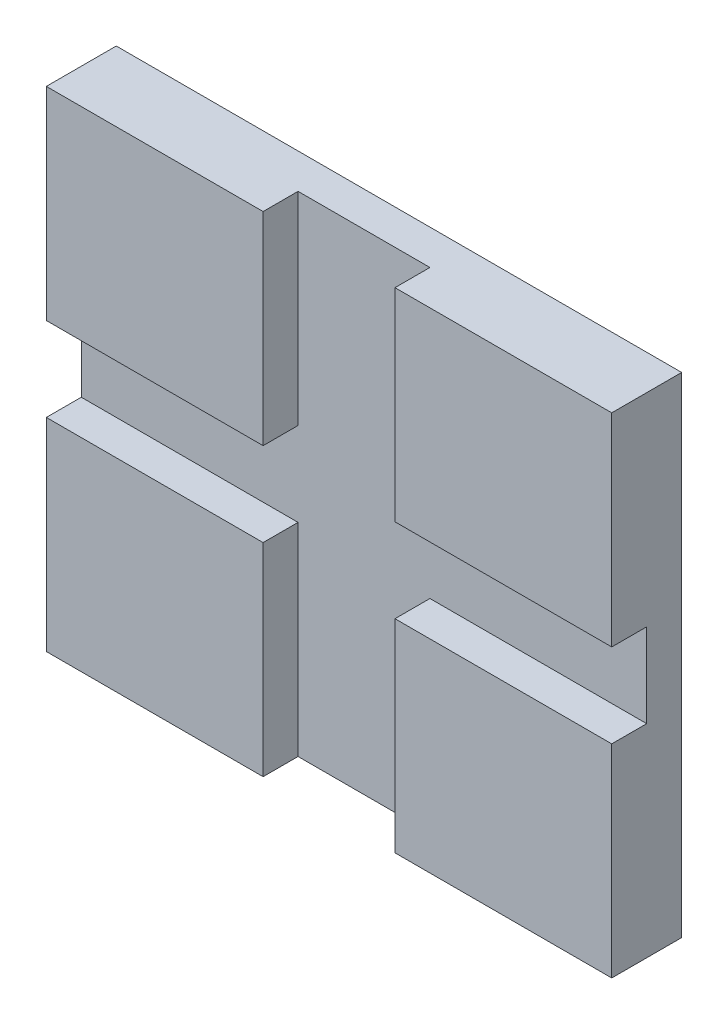
ISO-10303-21;
HEADER;
FILE_DESCRIPTION(('STEP AP214'),'2;1');
FILE_NAME('part.step','',(''),(''),'','','');
FILE_SCHEMA(('AUTOMOTIVE_DESIGN { 1 0 10303 214 1 1 1 1 }'));
ENDSEC;
DATA;
#1=APPLICATION_CONTEXT('core data for automotive mechanical design processes');
#2=APPLICATION_PROTOCOL_DEFINITION('international standard','automotive_design',2000,#1);
#3=PRODUCT_CONTEXT('',#1,'mechanical');
#4=PRODUCT('Part','Part','',(#3));
#5=PRODUCT_RELATED_PRODUCT_CATEGORY('part','',(#4));
#6=PRODUCT_DEFINITION_FORMATION('','',#4);
#7=PRODUCT_DEFINITION_CONTEXT('part definition',#1,'design');
#8=PRODUCT_DEFINITION('design','',#6,#7);
#9=PRODUCT_DEFINITION_SHAPE('','',#8);
#10=(LENGTH_UNIT() NAMED_UNIT(*) SI_UNIT(.MILLI.,.METRE.));
#11=(NAMED_UNIT(*) PLANE_ANGLE_UNIT() SI_UNIT($,.RADIAN.));
#12=(NAMED_UNIT(*) SI_UNIT($,.STERADIAN.) SOLID_ANGLE_UNIT());
#13=UNCERTAINTY_MEASURE_WITH_UNIT(LENGTH_MEASURE(1.E-05),#10,'distance_accuracy_value','');
#14=(GEOMETRIC_REPRESENTATION_CONTEXT(3) GLOBAL_UNCERTAINTY_ASSIGNED_CONTEXT((#13)) GLOBAL_UNIT_ASSIGNED_CONTEXT((#10,
#11,#12)) REPRESENTATION_CONTEXT('',''));
#15=CARTESIAN_POINT('',(0.,0.,0.));
#16=DIRECTION('',(0.,0.,1.));
#17=DIRECTION('',(1.,0.,0.));
#18=AXIS2_PLACEMENT_3D('',#15,#16,#17);
#19=CARTESIAN_POINT('',(-80.86,0.,10.));
#20=DIRECTION('',(1.,0.,0.));
#21=DIRECTION('',(0.,1.,0.));
#22=AXIS2_PLACEMENT_3D('',#19,#20,#21);
#23=PLANE('',#22);
#24=DIRECTION('',(0.,-1.,0.));
#25=VECTOR('',#24,1.);
#26=CARTESIAN_POINT('',(-80.86,0.,0.));
#27=LINE('',#26,#25);
#28=CARTESIAN_POINT('',(-80.86,70.,0.));
#29=VERTEX_POINT('',#28);
#30=CARTESIAN_POINT('',(-80.86,-70.,0.));
#31=VERTEX_POINT('',#30);
#32=EDGE_CURVE('E318',#29,#31,#27,.T.);
#33=ORIENTED_EDGE('',*,*,#32,.T.);
#34=DIRECTION('',(0.,0.,-1.));
#35=VECTOR('',#34,1.);
#36=CARTESIAN_POINT('',(-80.86,-70.,10.));
#37=LINE('',#36,#35);
#38=CARTESIAN_POINT('',(-80.86,-70.,20.));
#39=VERTEX_POINT('',#38);
#40=EDGE_CURVE('E11',#39,#31,#37,.T.);
#41=ORIENTED_EDGE('',*,*,#40,.F.);
#42=DIRECTION('',(0.,-1.,0.));
#43=VECTOR('',#42,1.);
#44=CARTESIAN_POINT('',(-80.86,-70.,20.));
#45=LINE('',#44,#43);
#46=CARTESIAN_POINT('',(-80.86,-12.,20.));
#47=VERTEX_POINT('',#46);
#48=EDGE_CURVE('E288',#47,#39,#45,.T.);
#49=ORIENTED_EDGE('',*,*,#48,.F.);
#50=DIRECTION('',(0.,0.,-1.));
#51=VECTOR('',#50,1.);
#52=CARTESIAN_POINT('',(-80.86,-12.,20.));
#53=LINE('',#52,#51);
#54=CARTESIAN_POINT('',(-80.86,-12.,10.));
#55=VERTEX_POINT('',#54);
#56=EDGE_CURVE('E302',#47,#55,#53,.T.);
#57=ORIENTED_EDGE('',*,*,#56,.T.);
#58=DIRECTION('',(0.,-1.,0.));
#59=VECTOR('',#58,1.);
#60=CARTESIAN_POINT('',(-80.86,0.,10.));
#61=LINE('',#60,#59);
#62=CARTESIAN_POINT('',(-80.86,12.,10.));
#63=VERTEX_POINT('',#62);
#64=EDGE_CURVE('E60',#63,#55,#61,.T.);
#65=ORIENTED_EDGE('',*,*,#64,.F.);
#66=DIRECTION('',(0.,0.,-1.));
#67=VECTOR('',#66,1.);
#68=CARTESIAN_POINT('',(-80.86,12.,20.));
#69=LINE('',#68,#67);
#70=CARTESIAN_POINT('',(-80.86,12.,20.));
#71=VERTEX_POINT('',#70);
#72=EDGE_CURVE('E220',#71,#63,#69,.T.);
#73=ORIENTED_EDGE('',*,*,#72,.F.);
#74=DIRECTION('',(0.,1.,0.));
#75=VECTOR('',#74,1.);
#76=CARTESIAN_POINT('',(-80.86,70.,20.));
#77=LINE('',#76,#75);
#78=CARTESIAN_POINT('',(-80.86,70.,20.));
#79=VERTEX_POINT('',#78);
#80=EDGE_CURVE('E204',#71,#79,#77,.T.);
#81=ORIENTED_EDGE('',*,*,#80,.T.);
#82=DIRECTION('',(0.,0.,-1.));
#83=VECTOR('',#82,1.);
#84=CARTESIAN_POINT('',(-80.86,70.,10.));
#85=LINE('',#84,#83);
#86=EDGE_CURVE('E240',#79,#29,#85,.T.);
#87=ORIENTED_EDGE('',*,*,#86,.T.);
#88=EDGE_LOOP('',(#33,#41,#49,#57,#65,#73,#81,#87));
#89=FACE_BOUND('',#88,.T.);
#90=ADVANCED_FACE('F39',(#89),#23,.F.);
#91=CARTESIAN_POINT('',(-80.86,-70.,10.));
#92=DIRECTION('',(0.,1.,0.));
#93=DIRECTION('',(-1.,0.,0.));
#94=AXIS2_PLACEMENT_3D('',#91,#92,#93);
#95=PLANE('',#94);
#96=DIRECTION('',(1.,0.,0.));
#97=VECTOR('',#96,1.);
#98=CARTESIAN_POINT('',(-80.86,-70.,0.));
#99=LINE('',#98,#97);
#100=CARTESIAN_POINT('',(80.86,-70.,0.));
#101=VERTEX_POINT('',#100);
#102=EDGE_CURVE('E321',#31,#101,#99,.T.);
#103=ORIENTED_EDGE('',*,*,#102,.T.);
#104=DIRECTION('',(0.,0.,-1.));
#105=VECTOR('',#104,1.);
#106=CARTESIAN_POINT('',(80.86,-70.,10.));
#107=LINE('',#106,#105);
#108=CARTESIAN_POINT('',(80.86,-70.,20.));
#109=VERTEX_POINT('',#108);
#110=EDGE_CURVE('E283',#109,#101,#107,.T.);
#111=ORIENTED_EDGE('',*,*,#110,.F.);
#112=DIRECTION('',(-1.,0.,0.));
#113=VECTOR('',#112,1.);
#114=CARTESIAN_POINT('',(80.86,-70.,20.));
#115=LINE('',#114,#113);
#116=CARTESIAN_POINT('',(18.86,-70.,20.));
#117=VERTEX_POINT('',#116);
#118=EDGE_CURVE('E251',#109,#117,#115,.T.);
#119=ORIENTED_EDGE('',*,*,#118,.T.);
#120=DIRECTION('',(0.,0.,-1.));
#121=VECTOR('',#120,1.);
#122=CARTESIAN_POINT('',(18.86,-70.,20.));
#123=LINE('',#122,#121);
#124=CARTESIAN_POINT('',(18.86,-70.,10.));
#125=VERTEX_POINT('',#124);
#126=EDGE_CURVE('E275',#117,#125,#123,.T.);
#127=ORIENTED_EDGE('',*,*,#126,.T.);
#128=DIRECTION('',(1.,0.,0.));
#129=VECTOR('',#128,1.);
#130=CARTESIAN_POINT('',(-80.86,-70.,10.));
#131=LINE('',#130,#129);
#132=CARTESIAN_POINT('',(-18.86,-70.,10.));
#133=VERTEX_POINT('',#132);
#134=EDGE_CURVE('E47',#133,#125,#131,.T.);
#135=ORIENTED_EDGE('',*,*,#134,.F.);
#136=DIRECTION('',(0.,0.,-1.));
#137=VECTOR('',#136,1.);
#138=CARTESIAN_POINT('',(-18.86,-70.,20.));
#139=LINE('',#138,#137);
#140=CARTESIAN_POINT('',(-18.86,-70.,20.));
#141=VERTEX_POINT('',#140);
#142=EDGE_CURVE('E314',#141,#133,#139,.T.);
#143=ORIENTED_EDGE('',*,*,#142,.F.);
#144=DIRECTION('',(1.,0.,0.));
#145=VECTOR('',#144,1.);
#146=CARTESIAN_POINT('',(-80.86,-70.,20.));
#147=LINE('',#146,#145);
#148=EDGE_CURVE('E292',#39,#141,#147,.T.);
#149=ORIENTED_EDGE('',*,*,#148,.F.);
#150=ORIENTED_EDGE('',*,*,#40,.T.);
#151=EDGE_LOOP('',(#103,#111,#119,#127,#135,#143,#149,#150));
#152=FACE_BOUND('',#151,.T.);
#153=ADVANCED_FACE('F329',(#152),#95,.F.);
#154=CARTESIAN_POINT('',(0.,0.,10.));
#155=DIRECTION('',(0.,0.,1.));
#156=DIRECTION('',(1.,0.,0.));
#157=AXIS2_PLACEMENT_3D('',#154,#155,#156);
#158=PLANE('',#157);
#159=DIRECTION('',(-1.,0.,0.));
#160=VECTOR('',#159,1.);
#161=CARTESIAN_POINT('',(-80.86,-12.,10.));
#162=LINE('',#161,#160);
#163=CARTESIAN_POINT('',(-18.86,-12.,10.));
#164=VERTEX_POINT('',#163);
#165=EDGE_CURVE('E293',#164,#55,#162,.T.);
#166=ORIENTED_EDGE('',*,*,#165,.F.);
#167=DIRECTION('',(0.,1.,0.));
#168=VECTOR('',#167,1.);
#169=CARTESIAN_POINT('',(-18.86,-70.,10.));
#170=LINE('',#169,#168);
#171=EDGE_CURVE('E54',#133,#164,#170,.T.);
#172=ORIENTED_EDGE('',*,*,#171,.F.);
#173=ORIENTED_EDGE('',*,*,#134,.T.);
#174=DIRECTION('',(0.,1.,0.));
#175=VECTOR('',#174,1.);
#176=CARTESIAN_POINT('',(18.86,-70.,10.));
#177=LINE('',#176,#175);
#178=CARTESIAN_POINT('',(18.86,-12.,10.));
#179=VERTEX_POINT('',#178);
#180=EDGE_CURVE('E246',#125,#179,#177,.T.);
#181=ORIENTED_EDGE('',*,*,#180,.T.);
#182=DIRECTION('',(1.,0.,0.));
#183=VECTOR('',#182,1.);
#184=CARTESIAN_POINT('',(80.86,-12.,10.));
#185=LINE('',#184,#183);
#186=CARTESIAN_POINT('',(80.86,-12.,10.));
#187=VERTEX_POINT('',#186);
#188=EDGE_CURVE('E252',#179,#187,#185,.T.);
#189=ORIENTED_EDGE('',*,*,#188,.T.);
#190=DIRECTION('',(0.,-1.,0.));
#191=VECTOR('',#190,1.);
#192=CARTESIAN_POINT('',(80.86,0.,10.));
#193=LINE('',#192,#191);
#194=CARTESIAN_POINT('',(80.86,12.,10.));
#195=VERTEX_POINT('',#194);
#196=EDGE_CURVE('E279',#195,#187,#193,.T.);
#197=ORIENTED_EDGE('',*,*,#196,.F.);
#198=DIRECTION('',(1.,0.,0.));
#199=VECTOR('',#198,1.);
#200=CARTESIAN_POINT('',(80.86,12.,10.));
#201=LINE('',#200,#199);
#202=CARTESIAN_POINT('',(18.86,12.,10.));
#203=VERTEX_POINT('',#202);
#204=EDGE_CURVE('E163',#203,#195,#201,.T.);
#205=ORIENTED_EDGE('',*,*,#204,.F.);
#206=DIRECTION('',(0.,-1.,0.));
#207=VECTOR('',#206,1.);
#208=CARTESIAN_POINT('',(18.86,70.,10.));
#209=LINE('',#208,#207);
#210=CARTESIAN_POINT('',(18.86,70.,10.));
#211=VERTEX_POINT('',#210);
#212=EDGE_CURVE('E190',#211,#203,#209,.T.);
#213=ORIENTED_EDGE('',*,*,#212,.F.);
#214=DIRECTION('',(1.,0.,0.));
#215=VECTOR('',#214,1.);
#216=CARTESIAN_POINT('',(-80.86,70.,10.));
#217=LINE('',#216,#215);
#218=CARTESIAN_POINT('',(-18.86,70.,10.));
#219=VERTEX_POINT('',#218);
#220=EDGE_CURVE('E237',#219,#211,#217,.T.);
#221=ORIENTED_EDGE('',*,*,#220,.F.);
#222=DIRECTION('',(0.,-1.,0.));
#223=VECTOR('',#222,1.);
#224=CARTESIAN_POINT('',(-18.86,70.,10.));
#225=LINE('',#224,#223);
#226=CARTESIAN_POINT('',(-18.86,12.,10.));
#227=VERTEX_POINT('',#226);
#228=EDGE_CURVE('E175',#219,#227,#225,.T.);
#229=ORIENTED_EDGE('',*,*,#228,.T.);
#230=DIRECTION('',(-1.,0.,0.));
#231=VECTOR('',#230,1.);
#232=CARTESIAN_POINT('',(-80.86,12.,10.));
#233=LINE('',#232,#231);
#234=EDGE_CURVE('E209',#227,#63,#233,.T.);
#235=ORIENTED_EDGE('',*,*,#234,.T.);
#236=ORIENTED_EDGE('',*,*,#64,.T.);
#237=EDGE_LOOP('',(#166,#172,#173,#181,#189,#197,#205,#213,#221,#229,#235,#236));
#238=FACE_BOUND('',#237,.T.);
#239=ADVANCED_FACE('F347',(#238),#158,.T.);
#240=CARTESIAN_POINT('',(0.,0.,0.));
#241=DIRECTION('',(0.,0.,1.));
#242=DIRECTION('',(1.,0.,0.));
#243=AXIS2_PLACEMENT_3D('',#240,#241,#242);
#244=PLANE('',#243);
#245=ORIENTED_EDGE('',*,*,#32,.F.);
#246=DIRECTION('',(1.,0.,0.));
#247=VECTOR('',#246,1.);
#248=CARTESIAN_POINT('',(-80.86,70.,0.));
#249=LINE('',#248,#247);
#250=CARTESIAN_POINT('',(80.86,70.,0.));
#251=VERTEX_POINT('',#250);
#252=EDGE_CURVE('E236',#29,#251,#249,.T.);
#253=ORIENTED_EDGE('',*,*,#252,.T.);
#254=DIRECTION('',(0.,-1.,0.));
#255=VECTOR('',#254,1.);
#256=CARTESIAN_POINT('',(80.86,0.,0.));
#257=LINE('',#256,#255);
#258=EDGE_CURVE('E170',#251,#101,#257,.T.);
#259=ORIENTED_EDGE('',*,*,#258,.T.);
#260=ORIENTED_EDGE('',*,*,#102,.F.);
#261=EDGE_LOOP('',(#245,#253,#259,#260));
#262=FACE_BOUND('',#261,.T.);
#263=ADVANCED_FACE('F334',(#262),#244,.F.);
#264=CARTESIAN_POINT('',(-18.86,-70.,20.));
#265=DIRECTION('',(-1.,0.,0.));
#266=DIRECTION('',(0.,0.,1.));
#267=AXIS2_PLACEMENT_3D('',#264,#265,#266);
#268=PLANE('',#267);
#269=ORIENTED_EDGE('',*,*,#171,.T.);
#270=DIRECTION('',(0.,0.,-1.));
#271=VECTOR('',#270,1.);
#272=CARTESIAN_POINT('',(-18.86,-12.,20.));
#273=LINE('',#272,#271);
#274=CARTESIAN_POINT('',(-18.86,-12.,20.));
#275=VERTEX_POINT('',#274);
#276=EDGE_CURVE('E310',#275,#164,#273,.T.);
#277=ORIENTED_EDGE('',*,*,#276,.F.);
#278=DIRECTION('',(0.,1.,0.));
#279=VECTOR('',#278,1.);
#280=CARTESIAN_POINT('',(-18.86,-70.,20.));
#281=LINE('',#280,#279);
#282=EDGE_CURVE('E296',#141,#275,#281,.T.);
#283=ORIENTED_EDGE('',*,*,#282,.F.);
#284=ORIENTED_EDGE('',*,*,#142,.T.);
#285=EDGE_LOOP('',(#269,#277,#283,#284));
#286=FACE_BOUND('',#285,.T.);
#287=ADVANCED_FACE('F384',(#286),#268,.F.);
#288=CARTESIAN_POINT('',(-80.86,-12.,20.));
#289=DIRECTION('',(0.,-1.,0.));
#290=DIRECTION('',(0.,0.,-1.));
#291=AXIS2_PLACEMENT_3D('',#288,#289,#290);
#292=PLANE('',#291);
#293=ORIENTED_EDGE('',*,*,#165,.T.);
#294=ORIENTED_EDGE('',*,*,#56,.F.);
#295=DIRECTION('',(-1.,0.,0.));
#296=VECTOR('',#295,1.);
#297=CARTESIAN_POINT('',(-80.86,-12.,20.));
#298=LINE('',#297,#296);
#299=EDGE_CURVE('E299',#275,#47,#298,.T.);
#300=ORIENTED_EDGE('',*,*,#299,.F.);
#301=ORIENTED_EDGE('',*,*,#276,.T.);
#302=EDGE_LOOP('',(#293,#294,#300,#301));
#303=FACE_BOUND('',#302,.T.);
#304=ADVANCED_FACE('F388',(#303),#292,.F.);
#305=CARTESIAN_POINT('',(0.,0.,20.));
#306=DIRECTION('',(0.,0.,-1.));
#307=DIRECTION('',(-1.,0.,0.));
#308=AXIS2_PLACEMENT_3D('',#305,#306,#307);
#309=PLANE('',#308);
#310=ORIENTED_EDGE('',*,*,#48,.T.);
#311=ORIENTED_EDGE('',*,*,#148,.T.);
#312=ORIENTED_EDGE('',*,*,#282,.T.);
#313=ORIENTED_EDGE('',*,*,#299,.T.);
#314=EDGE_LOOP('',(#310,#311,#312,#313));
#315=FACE_BOUND('',#314,.T.);
#316=ADVANCED_FACE('F372',(#315),#309,.F.);
#317=CARTESIAN_POINT('',(80.86,0.,10.));
#318=DIRECTION('',(-1.,0.,0.));
#319=DIRECTION('',(0.,1.,0.));
#320=AXIS2_PLACEMENT_3D('',#317,#318,#319);
#321=PLANE('',#320);
#322=ORIENTED_EDGE('',*,*,#258,.F.);
#323=DIRECTION('',(0.,0.,-1.));
#324=VECTOR('',#323,1.);
#325=CARTESIAN_POINT('',(80.86,70.,10.));
#326=LINE('',#325,#324);
#327=CARTESIAN_POINT('',(80.86,70.,20.));
#328=VERTEX_POINT('',#327);
#329=EDGE_CURVE('E166',#328,#251,#326,.T.);
#330=ORIENTED_EDGE('',*,*,#329,.F.);
#331=DIRECTION('',(0.,1.,0.));
#332=VECTOR('',#331,1.);
#333=CARTESIAN_POINT('',(80.86,70.,20.));
#334=LINE('',#333,#332);
#335=CARTESIAN_POINT('',(80.86,12.,20.));
#336=VERTEX_POINT('',#335);
#337=EDGE_CURVE('E151',#336,#328,#334,.T.);
#338=ORIENTED_EDGE('',*,*,#337,.F.);
#339=DIRECTION('',(0.,0.,-1.));
#340=VECTOR('',#339,1.);
#341=CARTESIAN_POINT('',(80.86,12.,20.));
#342=LINE('',#341,#340);
#343=EDGE_CURVE('E189',#336,#195,#342,.T.);
#344=ORIENTED_EDGE('',*,*,#343,.T.);
#345=ORIENTED_EDGE('',*,*,#196,.T.);
#346=DIRECTION('',(0.,0.,-1.));
#347=VECTOR('',#346,1.);
#348=CARTESIAN_POINT('',(80.86,-12.,20.));
#349=LINE('',#348,#347);
#350=CARTESIAN_POINT('',(80.86,-12.,20.));
#351=VERTEX_POINT('',#350);
#352=EDGE_CURVE('E263',#351,#187,#349,.T.);
#353=ORIENTED_EDGE('',*,*,#352,.F.);
#354=DIRECTION('',(0.,-1.,0.));
#355=VECTOR('',#354,1.);
#356=CARTESIAN_POINT('',(80.86,-70.,20.));
#357=LINE('',#356,#355);
#358=EDGE_CURVE('E247',#351,#109,#357,.T.);
#359=ORIENTED_EDGE('',*,*,#358,.T.);
#360=ORIENTED_EDGE('',*,*,#110,.T.);
#361=EDGE_LOOP('',(#322,#330,#338,#344,#345,#353,#359,#360));
#362=FACE_BOUND('',#361,.T.);
#363=ADVANCED_FACE('F167',(#362),#321,.F.);
#364=CARTESIAN_POINT('',(18.86,-70.,20.));
#365=DIRECTION('',(1.,0.,0.));
#366=DIRECTION('',(0.,0.,1.));
#367=AXIS2_PLACEMENT_3D('',#364,#365,#366);
#368=PLANE('',#367);
#369=ORIENTED_EDGE('',*,*,#180,.F.);
#370=ORIENTED_EDGE('',*,*,#126,.F.);
#371=DIRECTION('',(0.,1.,0.));
#372=VECTOR('',#371,1.);
#373=CARTESIAN_POINT('',(18.86,-70.,20.));
#374=LINE('',#373,#372);
#375=CARTESIAN_POINT('',(18.86,-12.,20.));
#376=VERTEX_POINT('',#375);
#377=EDGE_CURVE('E256',#117,#376,#374,.T.);
#378=ORIENTED_EDGE('',*,*,#377,.T.);
#379=DIRECTION('',(0.,0.,-1.));
#380=VECTOR('',#379,1.);
#381=CARTESIAN_POINT('',(18.86,-12.,20.));
#382=LINE('',#381,#380);
#383=EDGE_CURVE('E272',#376,#179,#382,.T.);
#384=ORIENTED_EDGE('',*,*,#383,.T.);
#385=EDGE_LOOP('',(#369,#370,#378,#384));
#386=FACE_BOUND('',#385,.T.);
#387=ADVANCED_FACE('F364',(#386),#368,.F.);
#388=CARTESIAN_POINT('',(80.86,-12.,20.));
#389=DIRECTION('',(0.,-1.,0.));
#390=DIRECTION('',(0.,0.,-1.));
#391=AXIS2_PLACEMENT_3D('',#388,#389,#390);
#392=PLANE('',#391);
#393=ORIENTED_EDGE('',*,*,#188,.F.);
#394=ORIENTED_EDGE('',*,*,#383,.F.);
#395=DIRECTION('',(1.,0.,0.));
#396=VECTOR('',#395,1.);
#397=CARTESIAN_POINT('',(80.86,-12.,20.));
#398=LINE('',#397,#396);
#399=EDGE_CURVE('E260',#376,#351,#398,.T.);
#400=ORIENTED_EDGE('',*,*,#399,.T.);
#401=ORIENTED_EDGE('',*,*,#352,.T.);
#402=EDGE_LOOP('',(#393,#394,#400,#401));
#403=FACE_BOUND('',#402,.T.);
#404=ADVANCED_FACE('F358',(#403),#392,.F.);
#405=CARTESIAN_POINT('',(0.,0.,20.));
#406=DIRECTION('',(0.,0.,-1.));
#407=DIRECTION('',(1.,0.,0.));
#408=AXIS2_PLACEMENT_3D('',#405,#406,#407);
#409=PLANE('',#408);
#410=ORIENTED_EDGE('',*,*,#358,.F.);
#411=ORIENTED_EDGE('',*,*,#399,.F.);
#412=ORIENTED_EDGE('',*,*,#377,.F.);
#413=ORIENTED_EDGE('',*,*,#118,.F.);
#414=EDGE_LOOP('',(#410,#411,#412,#413));
#415=FACE_BOUND('',#414,.T.);
#416=ADVANCED_FACE('F360',(#415),#409,.F.);
#417=CARTESIAN_POINT('',(-80.86,70.,10.));
#418=DIRECTION('',(0.,-1.,0.));
#419=DIRECTION('',(-1.,0.,0.));
#420=AXIS2_PLACEMENT_3D('',#417,#418,#419);
#421=PLANE('',#420);
#422=ORIENTED_EDGE('',*,*,#252,.F.);
#423=ORIENTED_EDGE('',*,*,#86,.F.);
#424=DIRECTION('',(1.,0.,0.));
#425=VECTOR('',#424,1.);
#426=CARTESIAN_POINT('',(-80.86,70.,20.));
#427=LINE('',#426,#425);
#428=CARTESIAN_POINT('',(-18.86,70.,20.));
#429=VERTEX_POINT('',#428);
#430=EDGE_CURVE('E208',#79,#429,#427,.T.);
#431=ORIENTED_EDGE('',*,*,#430,.T.);
#432=DIRECTION('',(0.,0.,-1.));
#433=VECTOR('',#432,1.);
#434=CARTESIAN_POINT('',(-18.86,70.,20.));
#435=LINE('',#434,#433);
#436=EDGE_CURVE('E232',#429,#219,#435,.T.);
#437=ORIENTED_EDGE('',*,*,#436,.T.);
#438=ORIENTED_EDGE('',*,*,#220,.T.);
#439=DIRECTION('',(0.,0.,-1.));
#440=VECTOR('',#439,1.);
#441=CARTESIAN_POINT('',(18.86,70.,20.));
#442=LINE('',#441,#440);
#443=CARTESIAN_POINT('',(18.86,70.,20.));
#444=VERTEX_POINT('',#443);
#445=EDGE_CURVE('E176',#444,#211,#442,.T.);
#446=ORIENTED_EDGE('',*,*,#445,.F.);
#447=DIRECTION('',(-1.,0.,0.));
#448=VECTOR('',#447,1.);
#449=CARTESIAN_POINT('',(80.86,70.,20.));
#450=LINE('',#449,#448);
#451=EDGE_CURVE('E156',#328,#444,#450,.T.);
#452=ORIENTED_EDGE('',*,*,#451,.F.);
#453=ORIENTED_EDGE('',*,*,#329,.T.);
#454=EDGE_LOOP('',(#422,#423,#431,#437,#438,#446,#452,#453));
#455=FACE_BOUND('',#454,.T.);
#456=ADVANCED_FACE('F178',(#455),#421,.F.);
#457=CARTESIAN_POINT('',(-18.86,70.,20.));
#458=DIRECTION('',(-1.,0.,0.));
#459=DIRECTION('',(0.,0.,1.));
#460=AXIS2_PLACEMENT_3D('',#457,#458,#459);
#461=PLANE('',#460);
#462=ORIENTED_EDGE('',*,*,#228,.F.);
#463=ORIENTED_EDGE('',*,*,#436,.F.);
#464=DIRECTION('',(0.,-1.,0.));
#465=VECTOR('',#464,1.);
#466=CARTESIAN_POINT('',(-18.86,70.,20.));
#467=LINE('',#466,#465);
#468=CARTESIAN_POINT('',(-18.86,12.,20.));
#469=VERTEX_POINT('',#468);
#470=EDGE_CURVE('E213',#429,#469,#467,.T.);
#471=ORIENTED_EDGE('',*,*,#470,.T.);
#472=DIRECTION('',(0.,0.,-1.));
#473=VECTOR('',#472,1.);
#474=CARTESIAN_POINT('',(-18.86,12.,20.));
#475=LINE('',#474,#473);
#476=EDGE_CURVE('E229',#469,#227,#475,.T.);
#477=ORIENTED_EDGE('',*,*,#476,.T.);
#478=EDGE_LOOP('',(#462,#463,#471,#477));
#479=FACE_BOUND('',#478,.T.);
#480=ADVANCED_FACE('F345',(#479),#461,.F.);
#481=CARTESIAN_POINT('',(-80.86,12.,20.));
#482=DIRECTION('',(0.,1.,0.));
#483=DIRECTION('',(0.,0.,-1.));
#484=AXIS2_PLACEMENT_3D('',#481,#482,#483);
#485=PLANE('',#484);
#486=ORIENTED_EDGE('',*,*,#234,.F.);
#487=ORIENTED_EDGE('',*,*,#476,.F.);
#488=DIRECTION('',(-1.,0.,0.));
#489=VECTOR('',#488,1.);
#490=CARTESIAN_POINT('',(-80.86,12.,20.));
#491=LINE('',#490,#489);
#492=EDGE_CURVE('E217',#469,#71,#491,.T.);
#493=ORIENTED_EDGE('',*,*,#492,.T.);
#494=ORIENTED_EDGE('',*,*,#72,.T.);
#495=EDGE_LOOP('',(#486,#487,#493,#494));
#496=FACE_BOUND('',#495,.T.);
#497=ADVANCED_FACE('F403',(#496),#485,.F.);
#498=CARTESIAN_POINT('',(0.,0.,20.));
#499=DIRECTION('',(0.,0.,-1.));
#500=DIRECTION('',(-1.,0.,0.));
#501=AXIS2_PLACEMENT_3D('',#498,#499,#500);
#502=PLANE('',#501);
#503=ORIENTED_EDGE('',*,*,#80,.F.);
#504=ORIENTED_EDGE('',*,*,#492,.F.);
#505=ORIENTED_EDGE('',*,*,#470,.F.);
#506=ORIENTED_EDGE('',*,*,#430,.F.);
#507=EDGE_LOOP('',(#503,#504,#505,#506));
#508=FACE_BOUND('',#507,.T.);
#509=ADVANCED_FACE('F340',(#508),#502,.F.);
#510=CARTESIAN_POINT('',(18.86,70.,20.));
#511=DIRECTION('',(1.,0.,0.));
#512=DIRECTION('',(0.,0.,1.));
#513=AXIS2_PLACEMENT_3D('',#510,#511,#512);
#514=PLANE('',#513);
#515=ORIENTED_EDGE('',*,*,#212,.T.);
#516=DIRECTION('',(0.,0.,-1.));
#517=VECTOR('',#516,1.);
#518=CARTESIAN_POINT('',(18.86,12.,20.));
#519=LINE('',#518,#517);
#520=CARTESIAN_POINT('',(18.86,12.,20.));
#521=VERTEX_POINT('',#520);
#522=EDGE_CURVE('E199',#521,#203,#519,.T.);
#523=ORIENTED_EDGE('',*,*,#522,.F.);
#524=DIRECTION('',(0.,-1.,0.));
#525=VECTOR('',#524,1.);
#526=CARTESIAN_POINT('',(18.86,70.,20.));
#527=LINE('',#526,#525);
#528=EDGE_CURVE('E182',#444,#521,#527,.T.);
#529=ORIENTED_EDGE('',*,*,#528,.F.);
#530=ORIENTED_EDGE('',*,*,#445,.T.);
#531=EDGE_LOOP('',(#515,#523,#529,#530));
#532=FACE_BOUND('',#531,.T.);
#533=ADVANCED_FACE('F351',(#532),#514,.F.);
#534=CARTESIAN_POINT('',(80.86,12.,20.));
#535=DIRECTION('',(0.,1.,0.));
#536=DIRECTION('',(0.,0.,-1.));
#537=AXIS2_PLACEMENT_3D('',#534,#535,#536);
#538=PLANE('',#537);
#539=ORIENTED_EDGE('',*,*,#204,.T.);
#540=ORIENTED_EDGE('',*,*,#343,.F.);
#541=DIRECTION('',(1.,0.,0.));
#542=VECTOR('',#541,1.);
#543=CARTESIAN_POINT('',(80.86,12.,20.));
#544=LINE('',#543,#542);
#545=EDGE_CURVE('E158',#521,#336,#544,.T.);
#546=ORIENTED_EDGE('',*,*,#545,.F.);
#547=ORIENTED_EDGE('',*,*,#522,.T.);
#548=EDGE_LOOP('',(#539,#540,#546,#547));
#549=FACE_BOUND('',#548,.T.);
#550=ADVANCED_FACE('F353',(#549),#538,.F.);
#551=CARTESIAN_POINT('',(0.,0.,20.));
#552=DIRECTION('',(0.,0.,-1.));
#553=DIRECTION('',(1.,0.,0.));
#554=AXIS2_PLACEMENT_3D('',#551,#552,#553);
#555=PLANE('',#554);
#556=ORIENTED_EDGE('',*,*,#337,.T.);
#557=ORIENTED_EDGE('',*,*,#451,.T.);
#558=ORIENTED_EDGE('',*,*,#528,.T.);
#559=ORIENTED_EDGE('',*,*,#545,.T.);
#560=EDGE_LOOP('',(#556,#557,#558,#559));
#561=FACE_BOUND('',#560,.T.);
#562=ADVANCED_FACE('F153',(#561),#555,.F.);
#563=CLOSED_SHELL('',(#90,#153,#239,#263,#287,#304,#316,#363,#387,#404,#416,#456,#480,#497,#509,
#533,#550,#562));
#564=MANIFOLD_SOLID_BREP('B2',#563);
#565=ADVANCED_BREP_SHAPE_REPRESENTATION('',(#18,#564),#14);
#566=SHAPE_DEFINITION_REPRESENTATION(#9,#565);
ENDSEC;
END-ISO-10303-21;
